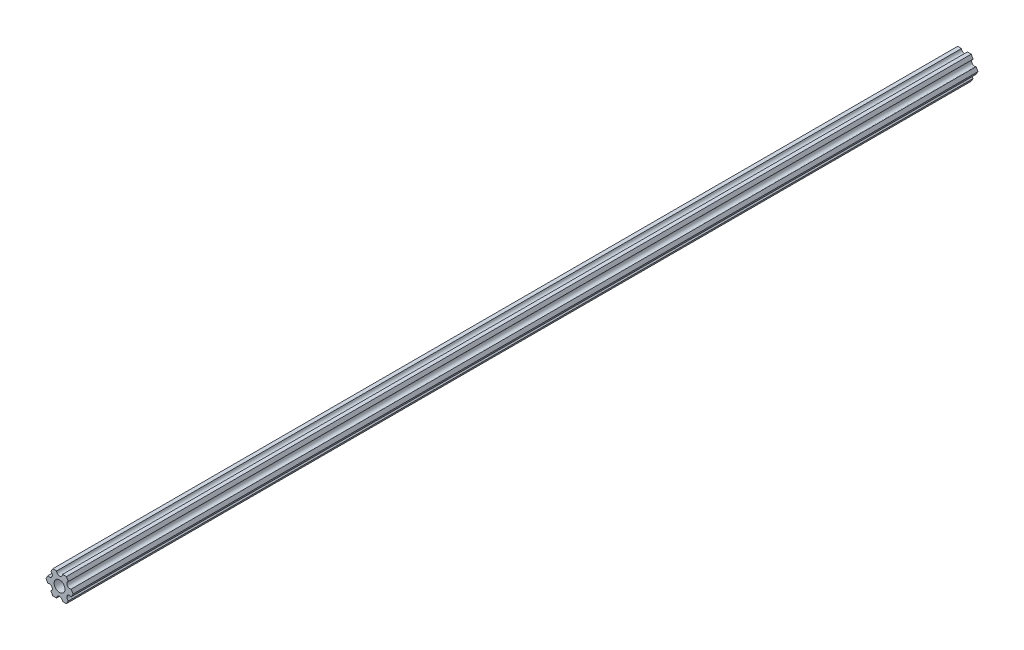
ISO-10303-21;
HEADER;
FILE_DESCRIPTION(('STEP AP214'),'2;1');
FILE_NAME('part.step','',(''),(''),'','','');
FILE_SCHEMA(('AUTOMOTIVE_DESIGN { 1 0 10303 214 1 1 1 1 }'));
ENDSEC;
DATA;
#1=APPLICATION_CONTEXT('core data for automotive mechanical design processes');
#2=APPLICATION_PROTOCOL_DEFINITION('international standard','automotive_design',2000,#1);
#3=PRODUCT_CONTEXT('',#1,'mechanical');
#4=PRODUCT('Part','Part','',(#3));
#5=PRODUCT_RELATED_PRODUCT_CATEGORY('part','',(#4));
#6=PRODUCT_DEFINITION_FORMATION('','',#4);
#7=PRODUCT_DEFINITION_CONTEXT('part definition',#1,'design');
#8=PRODUCT_DEFINITION('design','',#6,#7);
#9=PRODUCT_DEFINITION_SHAPE('','',#8);
#10=(LENGTH_UNIT() NAMED_UNIT(*) SI_UNIT(.MILLI.,.METRE.));
#11=(NAMED_UNIT(*) PLANE_ANGLE_UNIT() SI_UNIT($,.RADIAN.));
#12=(NAMED_UNIT(*) SI_UNIT($,.STERADIAN.) SOLID_ANGLE_UNIT());
#13=UNCERTAINTY_MEASURE_WITH_UNIT(LENGTH_MEASURE(1.E-05),#10,'distance_accuracy_value','');
#14=(GEOMETRIC_REPRESENTATION_CONTEXT(3) GLOBAL_UNCERTAINTY_ASSIGNED_CONTEXT((#13)) GLOBAL_UNIT_ASSIGNED_CONTEXT((#10,
#11,#12)) REPRESENTATION_CONTEXT('',''));
#15=CARTESIAN_POINT('',(0.,0.,0.));
#16=DIRECTION('',(0.,0.,1.));
#17=DIRECTION('',(1.,0.,0.));
#18=AXIS2_PLACEMENT_3D('',#15,#16,#17);
#19=CARTESIAN_POINT('',(5.49926112168156,3.17500033315933,244.475));
#20=DIRECTION('',(0.,0.,1.));
#21=DIRECTION('',(1.,0.,0.));
#22=AXIS2_PLACEMENT_3D('',#19,#20,#21);
#23=PLANE('',#22);
#24=DIRECTION('',(0.499999947533953,0.866025434075723,0.));
#25=VECTOR('',#24,1.);
#26=CARTESIAN_POINT('',(6.29301142309098,-1.80018429024546,244.475));
#27=LINE('',#26,#25);
#28=CARTESIAN_POINT('',(6.29301142309098,-1.80018429024546,244.475));
#29=VERTEX_POINT('',#28);
#30=CARTESIAN_POINT('',(7.33234841870826,4.44212519169686E-07,244.475));
#31=VERTEX_POINT('',#30);
#32=EDGE_CURVE('E230',#29,#31,#27,.T.);
#33=ORIENTED_EDGE('',*,*,#32,.T.);
#34=DIRECTION('',(-0.500000052466056,0.866025373493145,0.));
#35=VECTOR('',#34,1.);
#36=CARTESIAN_POINT('',(7.33234841870826,4.44212519169686E-07,244.475));
#37=LINE('',#36,#35);
#38=CARTESIAN_POINT('',(6.29301120497139,1.80018505273894,244.475));
#39=VERTEX_POINT('',#38);
#40=EDGE_CURVE('E127',#31,#39,#37,.T.);
#41=ORIENTED_EDGE('',*,*,#40,.T.);
#42=CARTESIAN_POINT('',(5.49926112168156,3.17500033315933,244.475));
#43=DIRECTION('',(0.,0.,-1.));
#44=DIRECTION('',(1.,0.,0.));
#45=AXIS2_PLACEMENT_3D('',#42,#43,#44);
#46=CIRCLE('',#45,1.5875);
#47=CARTESIAN_POINT('',(4.70551103839172,4.54981561357972,244.475));
#48=VERTEX_POINT('',#47);
#49=EDGE_CURVE('E291',#39,#48,#46,.T.);
#50=ORIENTED_EDGE('',*,*,#49,.T.);
#51=DIRECTION('',(-0.500000052466046,0.866025373493151,0.));
#52=VECTOR('',#51,1.);
#53=CARTESIAN_POINT('',(4.70551103839172,4.54981561357972,244.475));
#54=LINE('',#53,#52);
#55=CARTESIAN_POINT('',(3.66617382465481,6.35000022210627,244.475));
#56=VERTEX_POINT('',#55);
#57=EDGE_CURVE('E310',#48,#56,#54,.T.);
#58=ORIENTED_EDGE('',*,*,#57,.T.);
#59=DIRECTION('',(-0.999999999999998,-6.05825850611185E-08,0.));
#60=VECTOR('',#59,1.);
#61=CARTESIAN_POINT('',(3.66617382465481,6.35000022210627,244.475));
#62=LINE('',#61,#60);
#63=CARTESIAN_POINT('',(1.58749961530074,6.35000009617482,244.475));
#64=VERTEX_POINT('',#63);
#65=EDGE_CURVE('E307',#56,#64,#62,.T.);
#66=ORIENTED_EDGE('',*,*,#65,.T.);
#67=CARTESIAN_POINT('',(-3.84699260060323E-07,6.35,244.475));
#68=DIRECTION('',(0.,0.,-1.));
#69=DIRECTION('',(1.,0.,0.));
#70=AXIS2_PLACEMENT_3D('',#67,#68,#69);
#71=CIRCLE('',#70,1.5875);
#72=CARTESIAN_POINT('',(-1.58750038469926,6.34999990382518,244.475));
#73=VERTEX_POINT('',#72);
#74=EDGE_CURVE('E309',#64,#73,#71,.T.);
#75=ORIENTED_EDGE('',*,*,#74,.T.);
#76=DIRECTION('',(-0.999999999999998,-6.05825963273174E-08,0.));
#77=VECTOR('',#76,1.);
#78=CARTESIAN_POINT('',(-1.58750038469926,6.34999990382518,244.475));
#79=LINE('',#78,#77);
#80=CARTESIAN_POINT('',(-3.66617459405349,6.3499997778937,244.475));
#81=VERTEX_POINT('',#80);
#82=EDGE_CURVE('E312',#73,#81,#79,.T.);
#83=ORIENTED_EDGE('',*,*,#82,.T.);
#84=DIRECTION('',(-0.499999947533942,-0.866025434075729,0.));
#85=VECTOR('',#84,1.);
#86=CARTESIAN_POINT('',(-3.66617459405349,6.3499997778937,244.475));
#87=LINE('',#86,#85);
#88=CARTESIAN_POINT('',(-4.70551158967065,4.54981504343587,244.475));
#89=VERTEX_POINT('',#88);
#90=EDGE_CURVE('E318',#81,#89,#87,.T.);
#91=ORIENTED_EDGE('',*,*,#90,.T.);
#92=CARTESIAN_POINT('',(-5.49926150638082,3.17499966684067,244.475));
#93=DIRECTION('',(0.,0.,-1.));
#94=DIRECTION('',(1.,0.,0.));
#95=AXIS2_PLACEMENT_3D('',#92,#93,#94);
#96=CIRCLE('',#95,1.5875);
#97=CARTESIAN_POINT('',(-6.29301142309098,1.80018429024547,244.475));
#98=VERTEX_POINT('',#97);
#99=EDGE_CURVE('E320',#89,#98,#96,.T.);
#100=ORIENTED_EDGE('',*,*,#99,.T.);
#101=DIRECTION('',(-0.499999947533951,-0.866025434075724,0.));
#102=VECTOR('',#101,1.);
#103=CARTESIAN_POINT('',(-6.29301142309098,1.80018429024547,244.475));
#104=LINE('',#103,#102);
#105=CARTESIAN_POINT('',(-7.33234841870826,-4.44212523790841E-07,244.475));
#106=VERTEX_POINT('',#105);
#107=EDGE_CURVE('E322',#98,#106,#104,.T.);
#108=ORIENTED_EDGE('',*,*,#107,.T.);
#109=DIRECTION('',(0.500000052466045,-0.866025373493151,0.));
#110=VECTOR('',#109,1.);
#111=CARTESIAN_POINT('',(-7.33234841870826,-4.44212523790841E-07,244.475));
#112=LINE('',#111,#110);
#113=CARTESIAN_POINT('',(-6.29301120497141,-1.80018505273897,244.475));
#114=VERTEX_POINT('',#113);
#115=EDGE_CURVE('E324',#106,#114,#112,.T.);
#116=ORIENTED_EDGE('',*,*,#115,.T.);
#117=CARTESIAN_POINT('',(-5.49926112168156,-3.17500033315934,244.475));
#118=DIRECTION('',(0.,0.,-1.));
#119=DIRECTION('',(1.,0.,0.));
#120=AXIS2_PLACEMENT_3D('',#117,#118,#119);
#121=CIRCLE('',#120,1.5875);
#122=CARTESIAN_POINT('',(-4.70551103839172,-4.54981561357972,244.475));
#123=VERTEX_POINT('',#122);
#124=EDGE_CURVE('E326',#114,#123,#121,.T.);
#125=ORIENTED_EDGE('',*,*,#124,.T.);
#126=DIRECTION('',(0.500000052466045,-0.866025373493151,0.));
#127=VECTOR('',#126,1.);
#128=CARTESIAN_POINT('',(-4.70551103839172,-4.54981561357972,244.475));
#129=LINE('',#128,#127);
#130=CARTESIAN_POINT('',(-3.66617382465481,-6.35000022210628,244.475));
#131=VERTEX_POINT('',#130);
#132=EDGE_CURVE('E328',#123,#131,#129,.T.);
#133=ORIENTED_EDGE('',*,*,#132,.T.);
#134=DIRECTION('',(0.999999999999998,6.05825854783851E-08,0.));
#135=VECTOR('',#134,1.);
#136=CARTESIAN_POINT('',(-3.66617382465481,-6.35000022210628,244.475));
#137=LINE('',#136,#135);
#138=CARTESIAN_POINT('',(-1.58749961530074,-6.35000009617482,244.475));
#139=VERTEX_POINT('',#138);
#140=EDGE_CURVE('E330',#131,#139,#137,.T.);
#141=ORIENTED_EDGE('',*,*,#140,.T.);
#142=CARTESIAN_POINT('',(3.8469926204343E-07,-6.35,244.475));
#143=DIRECTION('',(0.,0.,-1.));
#144=DIRECTION('',(1.,0.,0.));
#145=AXIS2_PLACEMENT_3D('',#142,#143,#144);
#146=CIRCLE('',#145,1.5875);
#147=CARTESIAN_POINT('',(1.58750038469926,-6.34999990382518,244.475));
#148=VERTEX_POINT('',#147);
#149=EDGE_CURVE('E176',#139,#148,#146,.T.);
#150=ORIENTED_EDGE('',*,*,#149,.T.);
#151=DIRECTION('',(0.999999999999998,6.05825721258438E-08,0.));
#152=VECTOR('',#151,1.);
#153=CARTESIAN_POINT('',(1.58750038469926,-6.34999990382518,244.475));
#154=LINE('',#153,#152);
#155=CARTESIAN_POINT('',(3.66617459405346,-6.34999977789375,244.475));
#156=VERTEX_POINT('',#155);
#157=EDGE_CURVE('E170',#148,#156,#154,.T.);
#158=ORIENTED_EDGE('',*,*,#157,.T.);
#159=DIRECTION('',(0.499999947533941,0.86602543407573,0.));
#160=VECTOR('',#159,1.);
#161=CARTESIAN_POINT('',(3.66617459405346,-6.34999977789375,244.475));
#162=LINE('',#161,#160);
#163=CARTESIAN_POINT('',(4.70551158967065,-4.54981504343587,244.475));
#164=VERTEX_POINT('',#163);
#165=EDGE_CURVE('E174',#156,#164,#162,.T.);
#166=ORIENTED_EDGE('',*,*,#165,.T.);
#167=CARTESIAN_POINT('',(5.49926150638082,-3.17499966684067,244.475));
#168=DIRECTION('',(0.,0.,-1.));
#169=DIRECTION('',(1.,0.,0.));
#170=AXIS2_PLACEMENT_3D('',#167,#168,#169);
#171=CIRCLE('',#170,1.58750000000001);
#172=EDGE_CURVE('E54',#164,#29,#171,.T.);
#173=ORIENTED_EDGE('',*,*,#172,.T.);
#174=EDGE_LOOP('',(#33,#41,#50,#58,#66,#75,#83,#91,#100,#108,#116,#125,#133,#141,#150,#158,#166,#173));
#175=FACE_BOUND('',#174,.T.);
#176=CARTESIAN_POINT('',(0.,0.,244.475));
#177=DIRECTION('',(0.,0.,1.));
#178=DIRECTION('',(1.,0.,0.));
#179=AXIS2_PLACEMENT_3D('',#176,#177,#178);
#180=CIRCLE('',#179,2.9337);
#181=CARTESIAN_POINT('',(2.9337,0.,244.475));
#182=VERTEX_POINT('',#181);
#183=EDGE_CURVE('E199',#182,#182,#180,.T.);
#184=ORIENTED_EDGE('',*,*,#183,.F.);
#185=EDGE_LOOP('',(#184));
#186=FACE_BOUND('',#185,.T.);
#187=ADVANCED_FACE('F36',(#175,#186),#23,.T.);
#188=CARTESIAN_POINT('',(5.49926112168156,3.17500033315933,-244.475));
#189=DIRECTION('',(0.,0.,1.));
#190=DIRECTION('',(1.,0.,0.));
#191=AXIS2_PLACEMENT_3D('',#188,#189,#190);
#192=PLANE('',#191);
#193=DIRECTION('',(0.499999947533953,0.866025434075723,0.));
#194=VECTOR('',#193,1.);
#195=CARTESIAN_POINT('',(6.29301142309098,-1.80018429024546,-244.475));
#196=LINE('',#195,#194);
#197=CARTESIAN_POINT('',(6.29301142309098,-1.80018429024546,-244.475));
#198=VERTEX_POINT('',#197);
#199=CARTESIAN_POINT('',(7.33234841870826,4.44212519169686E-07,-244.475));
#200=VERTEX_POINT('',#199);
#201=EDGE_CURVE('E195',#198,#200,#196,.T.);
#202=ORIENTED_EDGE('',*,*,#201,.F.);
#203=CARTESIAN_POINT('',(5.49926150638082,-3.17499966684067,-244.475));
#204=DIRECTION('',(0.,0.,-1.));
#205=DIRECTION('',(1.,0.,0.));
#206=AXIS2_PLACEMENT_3D('',#203,#204,#205);
#207=CIRCLE('',#206,1.58750000000001);
#208=CARTESIAN_POINT('',(4.70551158967065,-4.54981504343587,-244.475));
#209=VERTEX_POINT('',#208);
#210=EDGE_CURVE('E119',#209,#198,#207,.T.);
#211=ORIENTED_EDGE('',*,*,#210,.F.);
#212=DIRECTION('',(0.499999947533941,0.86602543407573,0.));
#213=VECTOR('',#212,1.);
#214=CARTESIAN_POINT('',(3.66617459405346,-6.34999977789375,-244.475));
#215=LINE('',#214,#213);
#216=CARTESIAN_POINT('',(3.66617459405346,-6.34999977789375,-244.475));
#217=VERTEX_POINT('',#216);
#218=EDGE_CURVE('E113',#217,#209,#215,.T.);
#219=ORIENTED_EDGE('',*,*,#218,.F.);
#220=DIRECTION('',(0.999999999999998,6.05825721258438E-08,0.));
#221=VECTOR('',#220,1.);
#222=CARTESIAN_POINT('',(1.58750038469926,-6.34999990382518,-244.475));
#223=LINE('',#222,#221);
#224=CARTESIAN_POINT('',(1.58750038469926,-6.34999990382518,-244.475));
#225=VERTEX_POINT('',#224);
#226=EDGE_CURVE('E184',#225,#217,#223,.T.);
#227=ORIENTED_EDGE('',*,*,#226,.F.);
#228=CARTESIAN_POINT('',(3.8469926204343E-07,-6.35,-244.475));
#229=DIRECTION('',(0.,0.,-1.));
#230=DIRECTION('',(1.,0.,0.));
#231=AXIS2_PLACEMENT_3D('',#228,#229,#230);
#232=CIRCLE('',#231,1.5875);
#233=CARTESIAN_POINT('',(-1.58749961530074,-6.35000009617482,-244.475));
#234=VERTEX_POINT('',#233);
#235=EDGE_CURVE('E225',#234,#225,#232,.T.);
#236=ORIENTED_EDGE('',*,*,#235,.F.);
#237=DIRECTION('',(0.999999999999998,6.05825854783851E-08,0.));
#238=VECTOR('',#237,1.);
#239=CARTESIAN_POINT('',(-3.66617382465481,-6.35000022210628,-244.475));
#240=LINE('',#239,#238);
#241=CARTESIAN_POINT('',(-3.66617382465481,-6.35000022210628,-244.475));
#242=VERTEX_POINT('',#241);
#243=EDGE_CURVE('E223',#242,#234,#240,.T.);
#244=ORIENTED_EDGE('',*,*,#243,.F.);
#245=DIRECTION('',(0.500000052466045,-0.866025373493151,0.));
#246=VECTOR('',#245,1.);
#247=CARTESIAN_POINT('',(-4.70551103839172,-4.54981561357972,-244.475));
#248=LINE('',#247,#246);
#249=CARTESIAN_POINT('',(-4.70551103839172,-4.54981561357972,-244.475));
#250=VERTEX_POINT('',#249);
#251=EDGE_CURVE('E221',#250,#242,#248,.T.);
#252=ORIENTED_EDGE('',*,*,#251,.F.);
#253=CARTESIAN_POINT('',(-5.49926112168156,-3.17500033315934,-244.475));
#254=DIRECTION('',(0.,0.,-1.));
#255=DIRECTION('',(1.,0.,0.));
#256=AXIS2_PLACEMENT_3D('',#253,#254,#255);
#257=CIRCLE('',#256,1.5875);
#258=CARTESIAN_POINT('',(-6.29301120497141,-1.80018505273897,-244.475));
#259=VERTEX_POINT('',#258);
#260=EDGE_CURVE('E219',#259,#250,#257,.T.);
#261=ORIENTED_EDGE('',*,*,#260,.F.);
#262=DIRECTION('',(0.500000052466045,-0.866025373493151,0.));
#263=VECTOR('',#262,1.);
#264=CARTESIAN_POINT('',(-7.33234841870826,-4.44212523790841E-07,-244.475));
#265=LINE('',#264,#263);
#266=CARTESIAN_POINT('',(-7.33234841870826,-4.44212523790841E-07,-244.475));
#267=VERTEX_POINT('',#266);
#268=EDGE_CURVE('E217',#267,#259,#265,.T.);
#269=ORIENTED_EDGE('',*,*,#268,.F.);
#270=DIRECTION('',(-0.499999947533951,-0.866025434075724,0.));
#271=VECTOR('',#270,1.);
#272=CARTESIAN_POINT('',(-6.29301142309098,1.80018429024547,-244.475));
#273=LINE('',#272,#271);
#274=CARTESIAN_POINT('',(-6.29301142309098,1.80018429024547,-244.475));
#275=VERTEX_POINT('',#274);
#276=EDGE_CURVE('E215',#275,#267,#273,.T.);
#277=ORIENTED_EDGE('',*,*,#276,.F.);
#278=CARTESIAN_POINT('',(-5.49926150638082,3.17499966684067,-244.475));
#279=DIRECTION('',(0.,0.,-1.));
#280=DIRECTION('',(1.,0.,0.));
#281=AXIS2_PLACEMENT_3D('',#278,#279,#280);
#282=CIRCLE('',#281,1.5875);
#283=CARTESIAN_POINT('',(-4.70551158967065,4.54981504343587,-244.475));
#284=VERTEX_POINT('',#283);
#285=EDGE_CURVE('E213',#284,#275,#282,.T.);
#286=ORIENTED_EDGE('',*,*,#285,.F.);
#287=DIRECTION('',(-0.499999947533942,-0.866025434075729,0.));
#288=VECTOR('',#287,1.);
#289=CARTESIAN_POINT('',(-3.66617459405349,6.3499997778937,-244.475));
#290=LINE('',#289,#288);
#291=CARTESIAN_POINT('',(-3.66617459405349,6.3499997778937,-244.475));
#292=VERTEX_POINT('',#291);
#293=EDGE_CURVE('E211',#292,#284,#290,.T.);
#294=ORIENTED_EDGE('',*,*,#293,.F.);
#295=DIRECTION('',(-0.999999999999998,-6.05825963273174E-08,0.));
#296=VECTOR('',#295,1.);
#297=CARTESIAN_POINT('',(-1.58750038469926,6.34999990382518,-244.475));
#298=LINE('',#297,#296);
#299=CARTESIAN_POINT('',(-1.58750038469926,6.34999990382518,-244.475));
#300=VERTEX_POINT('',#299);
#301=EDGE_CURVE('E209',#300,#292,#298,.T.);
#302=ORIENTED_EDGE('',*,*,#301,.F.);
#303=CARTESIAN_POINT('',(-3.84699260060323E-07,6.35,-244.475));
#304=DIRECTION('',(0.,0.,-1.));
#305=DIRECTION('',(1.,0.,0.));
#306=AXIS2_PLACEMENT_3D('',#303,#304,#305);
#307=CIRCLE('',#306,1.5875);
#308=CARTESIAN_POINT('',(1.58749961530074,6.35000009617482,-244.475));
#309=VERTEX_POINT('',#308);
#310=EDGE_CURVE('E207',#309,#300,#307,.T.);
#311=ORIENTED_EDGE('',*,*,#310,.F.);
#312=DIRECTION('',(-0.999999999999998,-6.05825850611185E-08,0.));
#313=VECTOR('',#312,1.);
#314=CARTESIAN_POINT('',(3.66617382465481,6.35000022210627,-244.475));
#315=LINE('',#314,#313);
#316=CARTESIAN_POINT('',(3.66617382465481,6.35000022210627,-244.475));
#317=VERTEX_POINT('',#316);
#318=EDGE_CURVE('E205',#317,#309,#315,.T.);
#319=ORIENTED_EDGE('',*,*,#318,.F.);
#320=DIRECTION('',(-0.500000052466046,0.866025373493151,0.));
#321=VECTOR('',#320,1.);
#322=CARTESIAN_POINT('',(4.70551103839172,4.54981561357972,-244.475));
#323=LINE('',#322,#321);
#324=CARTESIAN_POINT('',(4.70551103839172,4.54981561357972,-244.475));
#325=VERTEX_POINT('',#324);
#326=EDGE_CURVE('E203',#325,#317,#323,.T.);
#327=ORIENTED_EDGE('',*,*,#326,.F.);
#328=CARTESIAN_POINT('',(5.49926112168156,3.17500033315933,-244.475));
#329=DIRECTION('',(0.,0.,-1.));
#330=DIRECTION('',(1.,0.,0.));
#331=AXIS2_PLACEMENT_3D('',#328,#329,#330);
#332=CIRCLE('',#331,1.5875);
#333=CARTESIAN_POINT('',(6.29301120497139,1.80018505273894,-244.475));
#334=VERTEX_POINT('',#333);
#335=EDGE_CURVE('E201',#334,#325,#332,.T.);
#336=ORIENTED_EDGE('',*,*,#335,.F.);
#337=DIRECTION('',(-0.500000052466056,0.866025373493145,0.));
#338=VECTOR('',#337,1.);
#339=CARTESIAN_POINT('',(7.33234841870826,4.44212519169686E-07,-244.475));
#340=LINE('',#339,#338);
#341=EDGE_CURVE('E198',#200,#334,#340,.T.);
#342=ORIENTED_EDGE('',*,*,#341,.F.);
#343=EDGE_LOOP('',(#202,#211,#219,#227,#236,#244,#252,#261,#269,#277,#286,#294,#302,#311,#319,
#327,#336,#342));
#344=FACE_BOUND('',#343,.T.);
#345=CARTESIAN_POINT('',(0.,0.,-244.475));
#346=DIRECTION('',(0.,0.,1.));
#347=DIRECTION('',(1.,0.,0.));
#348=AXIS2_PLACEMENT_3D('',#345,#346,#347);
#349=CIRCLE('',#348,2.9337);
#350=CARTESIAN_POINT('',(2.9337,0.,-244.475));
#351=VERTEX_POINT('',#350);
#352=EDGE_CURVE('E555',#351,#351,#349,.T.);
#353=ORIENTED_EDGE('',*,*,#352,.T.);
#354=EDGE_LOOP('',(#353));
#355=FACE_BOUND('',#354,.T.);
#356=ADVANCED_FACE('F295',(#344,#355),#192,.F.);
#357=CARTESIAN_POINT('',(6.29301142309098,-1.80018429024546,244.475));
#358=DIRECTION('',(-0.866025434075723,0.499999947533953,0.));
#359=DIRECTION('',(-0.499999947533953,-0.866025434075723,0.));
#360=AXIS2_PLACEMENT_3D('',#357,#358,#359);
#361=PLANE('',#360);
#362=ORIENTED_EDGE('',*,*,#201,.T.);
#363=DIRECTION('',(0.,0.,-1.));
#364=VECTOR('',#363,1.);
#365=CARTESIAN_POINT('',(7.33234841870826,4.44212519169686E-07,244.475));
#366=LINE('',#365,#364);
#367=EDGE_CURVE('E11',#31,#200,#366,.T.);
#368=ORIENTED_EDGE('',*,*,#367,.F.);
#369=ORIENTED_EDGE('',*,*,#32,.F.);
#370=DIRECTION('',(0.,0.,-1.));
#371=VECTOR('',#370,1.);
#372=CARTESIAN_POINT('',(6.29301142309098,-1.80018429024546,244.475));
#373=LINE('',#372,#371);
#374=EDGE_CURVE('E191',#29,#198,#373,.T.);
#375=ORIENTED_EDGE('',*,*,#374,.T.);
#376=EDGE_LOOP('',(#362,#368,#369,#375));
#377=FACE_BOUND('',#376,.T.);
#378=ADVANCED_FACE('F38',(#377),#361,.F.);
#379=CARTESIAN_POINT('',(7.33234841870826,4.44212519169686E-07,244.475));
#380=DIRECTION('',(-0.866025373493145,-0.500000052466057,0.));
#381=DIRECTION('',(0.500000052466056,-0.866025373493145,0.));
#382=AXIS2_PLACEMENT_3D('',#379,#380,#381);
#383=PLANE('',#382);
#384=ORIENTED_EDGE('',*,*,#341,.T.);
#385=DIRECTION('',(0.,0.,-1.));
#386=VECTOR('',#385,1.);
#387=CARTESIAN_POINT('',(6.29301120497139,1.80018505273894,244.475));
#388=LINE('',#387,#386);
#389=EDGE_CURVE('E46',#39,#334,#388,.T.);
#390=ORIENTED_EDGE('',*,*,#389,.F.);
#391=ORIENTED_EDGE('',*,*,#40,.F.);
#392=ORIENTED_EDGE('',*,*,#367,.T.);
#393=EDGE_LOOP('',(#384,#390,#391,#392));
#394=FACE_BOUND('',#393,.T.);
#395=ADVANCED_FACE('F364',(#394),#383,.F.);
#396=CARTESIAN_POINT('',(5.49926112168156,3.17500033315933,244.475));
#397=DIRECTION('',(0.,0.,-1.));
#398=DIRECTION('',(-1.,0.,0.));
#399=AXIS2_PLACEMENT_3D('',#396,#397,#398);
#400=CYLINDRICAL_SURFACE('',#399,1.5875);
#401=ORIENTED_EDGE('',*,*,#335,.T.);
#402=DIRECTION('',(0.,0.,-1.));
#403=VECTOR('',#402,1.);
#404=CARTESIAN_POINT('',(4.70551103839172,4.54981561357972,244.475));
#405=LINE('',#404,#403);
#406=EDGE_CURVE('E281',#48,#325,#405,.T.);
#407=ORIENTED_EDGE('',*,*,#406,.F.);
#408=ORIENTED_EDGE('',*,*,#49,.F.);
#409=ORIENTED_EDGE('',*,*,#389,.T.);
#410=EDGE_LOOP('',(#401,#407,#408,#409));
#411=FACE_BOUND('',#410,.T.);
#412=ADVANCED_FACE('F289',(#411),#400,.F.);
#413=CARTESIAN_POINT('',(4.70551103839172,4.54981561357972,244.475));
#414=DIRECTION('',(-0.866025373493151,-0.500000052466046,0.));
#415=DIRECTION('',(0.500000052466046,-0.866025373493151,0.));
#416=AXIS2_PLACEMENT_3D('',#413,#414,#415);
#417=PLANE('',#416);
#418=ORIENTED_EDGE('',*,*,#326,.T.);
#419=DIRECTION('',(0.,0.,-1.));
#420=VECTOR('',#419,1.);
#421=CARTESIAN_POINT('',(3.66617382465481,6.35000022210627,244.475));
#422=LINE('',#421,#420);
#423=EDGE_CURVE('E277',#56,#317,#422,.T.);
#424=ORIENTED_EDGE('',*,*,#423,.F.);
#425=ORIENTED_EDGE('',*,*,#57,.F.);
#426=ORIENTED_EDGE('',*,*,#406,.T.);
#427=EDGE_LOOP('',(#418,#424,#425,#426));
#428=FACE_BOUND('',#427,.T.);
#429=ADVANCED_FACE('F301',(#428),#417,.F.);
#430=CARTESIAN_POINT('',(3.66617382465481,6.35000022210627,244.475));
#431=DIRECTION('',(6.05825850611185E-08,-0.999999999999998,0.));
#432=DIRECTION('',(0.999999999999998,6.05825850611185E-08,0.));
#433=AXIS2_PLACEMENT_3D('',#430,#431,#432);
#434=PLANE('',#433);
#435=ORIENTED_EDGE('',*,*,#318,.T.);
#436=DIRECTION('',(0.,0.,-1.));
#437=VECTOR('',#436,1.);
#438=CARTESIAN_POINT('',(1.58749961530074,6.35000009617482,244.475));
#439=LINE('',#438,#437);
#440=EDGE_CURVE('E273',#64,#309,#439,.T.);
#441=ORIENTED_EDGE('',*,*,#440,.F.);
#442=ORIENTED_EDGE('',*,*,#65,.F.);
#443=ORIENTED_EDGE('',*,*,#423,.T.);
#444=EDGE_LOOP('',(#435,#441,#442,#443));
#445=FACE_BOUND('',#444,.T.);
#446=ADVANCED_FACE('F305',(#445),#434,.F.);
#447=CARTESIAN_POINT('',(-3.84699260060323E-07,6.35,244.475));
#448=DIRECTION('',(0.,0.,-1.));
#449=DIRECTION('',(-1.,0.,0.));
#450=AXIS2_PLACEMENT_3D('',#447,#448,#449);
#451=CYLINDRICAL_SURFACE('',#450,1.5875);
#452=ORIENTED_EDGE('',*,*,#310,.T.);
#453=DIRECTION('',(0.,0.,-1.));
#454=VECTOR('',#453,1.);
#455=CARTESIAN_POINT('',(-1.58750038469926,6.34999990382518,244.475));
#456=LINE('',#455,#454);
#457=EDGE_CURVE('E269',#73,#300,#456,.T.);
#458=ORIENTED_EDGE('',*,*,#457,.F.);
#459=ORIENTED_EDGE('',*,*,#74,.F.);
#460=ORIENTED_EDGE('',*,*,#440,.T.);
#461=EDGE_LOOP('',(#452,#458,#459,#460));
#462=FACE_BOUND('',#461,.T.);
#463=ADVANCED_FACE('F377',(#462),#451,.F.);
#464=CARTESIAN_POINT('',(-1.58750038469926,6.34999990382518,244.475));
#465=DIRECTION('',(6.05825963273174E-08,-0.999999999999998,0.));
#466=DIRECTION('',(0.999999999999998,6.05825963273174E-08,0.));
#467=AXIS2_PLACEMENT_3D('',#464,#465,#466);
#468=PLANE('',#467);
#469=ORIENTED_EDGE('',*,*,#301,.T.);
#470=DIRECTION('',(0.,0.,-1.));
#471=VECTOR('',#470,1.);
#472=CARTESIAN_POINT('',(-3.66617459405349,6.3499997778937,244.475));
#473=LINE('',#472,#471);
#474=EDGE_CURVE('E265',#81,#292,#473,.T.);
#475=ORIENTED_EDGE('',*,*,#474,.F.);
#476=ORIENTED_EDGE('',*,*,#82,.F.);
#477=ORIENTED_EDGE('',*,*,#457,.T.);
#478=EDGE_LOOP('',(#469,#475,#476,#477));
#479=FACE_BOUND('',#478,.T.);
#480=ADVANCED_FACE('F380',(#479),#468,.F.);
#481=CARTESIAN_POINT('',(-3.66617459405349,6.3499997778937,244.475));
#482=DIRECTION('',(0.866025434075729,-0.499999947533942,0.));
#483=DIRECTION('',(0.499999947533943,0.866025434075729,0.));
#484=AXIS2_PLACEMENT_3D('',#481,#482,#483);
#485=PLANE('',#484);
#486=ORIENTED_EDGE('',*,*,#293,.T.);
#487=DIRECTION('',(0.,0.,-1.));
#488=VECTOR('',#487,1.);
#489=CARTESIAN_POINT('',(-4.70551158967065,4.54981504343587,244.475));
#490=LINE('',#489,#488);
#491=EDGE_CURVE('E261',#89,#284,#490,.T.);
#492=ORIENTED_EDGE('',*,*,#491,.F.);
#493=ORIENTED_EDGE('',*,*,#90,.F.);
#494=ORIENTED_EDGE('',*,*,#474,.T.);
#495=EDGE_LOOP('',(#486,#492,#493,#494));
#496=FACE_BOUND('',#495,.T.);
#497=ADVANCED_FACE('F384',(#496),#485,.F.);
#498=CARTESIAN_POINT('',(-5.49926150638082,3.17499966684067,244.475));
#499=DIRECTION('',(0.,0.,-1.));
#500=DIRECTION('',(-1.,0.,0.));
#501=AXIS2_PLACEMENT_3D('',#498,#499,#500);
#502=CYLINDRICAL_SURFACE('',#501,1.5875);
#503=ORIENTED_EDGE('',*,*,#285,.T.);
#504=DIRECTION('',(0.,0.,-1.));
#505=VECTOR('',#504,1.);
#506=CARTESIAN_POINT('',(-6.29301142309098,1.80018429024547,244.475));
#507=LINE('',#506,#505);
#508=EDGE_CURVE('E257',#98,#275,#507,.T.);
#509=ORIENTED_EDGE('',*,*,#508,.F.);
#510=ORIENTED_EDGE('',*,*,#99,.F.);
#511=ORIENTED_EDGE('',*,*,#491,.T.);
#512=EDGE_LOOP('',(#503,#509,#510,#511));
#513=FACE_BOUND('',#512,.T.);
#514=ADVANCED_FACE('F388',(#513),#502,.F.);
#515=CARTESIAN_POINT('',(-6.29301142309098,1.80018429024547,244.475));
#516=DIRECTION('',(0.866025434075724,-0.499999947533952,0.));
#517=DIRECTION('',(0.499999947533952,0.866025434075724,0.));
#518=AXIS2_PLACEMENT_3D('',#515,#516,#517);
#519=PLANE('',#518);
#520=ORIENTED_EDGE('',*,*,#276,.T.);
#521=DIRECTION('',(0.,0.,-1.));
#522=VECTOR('',#521,1.);
#523=CARTESIAN_POINT('',(-7.33234841870826,-4.44212523790841E-07,244.475));
#524=LINE('',#523,#522);
#525=EDGE_CURVE('E253',#106,#267,#524,.T.);
#526=ORIENTED_EDGE('',*,*,#525,.F.);
#527=ORIENTED_EDGE('',*,*,#107,.F.);
#528=ORIENTED_EDGE('',*,*,#508,.T.);
#529=EDGE_LOOP('',(#520,#526,#527,#528));
#530=FACE_BOUND('',#529,.T.);
#531=ADVANCED_FACE('F392',(#530),#519,.F.);
#532=CARTESIAN_POINT('',(-7.33234841870826,-4.44212523790841E-07,244.475));
#533=DIRECTION('',(0.866025373493151,0.500000052466045,0.));
#534=DIRECTION('',(-0.500000052466045,0.866025373493151,0.));
#535=AXIS2_PLACEMENT_3D('',#532,#533,#534);
#536=PLANE('',#535);
#537=ORIENTED_EDGE('',*,*,#268,.T.);
#538=DIRECTION('',(0.,0.,-1.));
#539=VECTOR('',#538,1.);
#540=CARTESIAN_POINT('',(-6.29301120497141,-1.80018505273897,244.475));
#541=LINE('',#540,#539);
#542=EDGE_CURVE('E249',#114,#259,#541,.T.);
#543=ORIENTED_EDGE('',*,*,#542,.F.);
#544=ORIENTED_EDGE('',*,*,#115,.F.);
#545=ORIENTED_EDGE('',*,*,#525,.T.);
#546=EDGE_LOOP('',(#537,#543,#544,#545));
#547=FACE_BOUND('',#546,.T.);
#548=ADVANCED_FACE('F396',(#547),#536,.F.);
#549=CARTESIAN_POINT('',(-5.49926112168156,-3.17500033315934,244.475));
#550=DIRECTION('',(0.,0.,-1.));
#551=DIRECTION('',(-1.,0.,0.));
#552=AXIS2_PLACEMENT_3D('',#549,#550,#551);
#553=CYLINDRICAL_SURFACE('',#552,1.5875);
#554=ORIENTED_EDGE('',*,*,#260,.T.);
#555=DIRECTION('',(0.,0.,-1.));
#556=VECTOR('',#555,1.);
#557=CARTESIAN_POINT('',(-4.70551103839172,-4.54981561357972,244.475));
#558=LINE('',#557,#556);
#559=EDGE_CURVE('E245',#123,#250,#558,.T.);
#560=ORIENTED_EDGE('',*,*,#559,.F.);
#561=ORIENTED_EDGE('',*,*,#124,.F.);
#562=ORIENTED_EDGE('',*,*,#542,.T.);
#563=EDGE_LOOP('',(#554,#560,#561,#562));
#564=FACE_BOUND('',#563,.T.);
#565=ADVANCED_FACE('F400',(#564),#553,.F.);
#566=CARTESIAN_POINT('',(-4.70551103839172,-4.54981561357972,244.475));
#567=DIRECTION('',(0.866025373493151,0.500000052466045,0.));
#568=DIRECTION('',(-0.500000052466045,0.866025373493151,0.));
#569=AXIS2_PLACEMENT_3D('',#566,#567,#568);
#570=PLANE('',#569);
#571=ORIENTED_EDGE('',*,*,#251,.T.);
#572=DIRECTION('',(0.,0.,-1.));
#573=VECTOR('',#572,1.);
#574=CARTESIAN_POINT('',(-3.66617382465481,-6.35000022210628,244.475));
#575=LINE('',#574,#573);
#576=EDGE_CURVE('E241',#131,#242,#575,.T.);
#577=ORIENTED_EDGE('',*,*,#576,.F.);
#578=ORIENTED_EDGE('',*,*,#132,.F.);
#579=ORIENTED_EDGE('',*,*,#559,.T.);
#580=EDGE_LOOP('',(#571,#577,#578,#579));
#581=FACE_BOUND('',#580,.T.);
#582=ADVANCED_FACE('F404',(#581),#570,.F.);
#583=CARTESIAN_POINT('',(-3.66617382465481,-6.35000022210628,244.475));
#584=DIRECTION('',(-6.05825854783851E-08,0.999999999999998,0.));
#585=DIRECTION('',(-0.999999999999998,-6.05825854783851E-08,0.));
#586=AXIS2_PLACEMENT_3D('',#583,#584,#585);
#587=PLANE('',#586);
#588=ORIENTED_EDGE('',*,*,#243,.T.);
#589=DIRECTION('',(0.,0.,-1.));
#590=VECTOR('',#589,1.);
#591=CARTESIAN_POINT('',(-1.58749961530074,-6.35000009617482,244.475));
#592=LINE('',#591,#590);
#593=EDGE_CURVE('E237',#139,#234,#592,.T.);
#594=ORIENTED_EDGE('',*,*,#593,.F.);
#595=ORIENTED_EDGE('',*,*,#140,.F.);
#596=ORIENTED_EDGE('',*,*,#576,.T.);
#597=EDGE_LOOP('',(#588,#594,#595,#596));
#598=FACE_BOUND('',#597,.T.);
#599=ADVANCED_FACE('F336',(#598),#587,.F.);
#600=CARTESIAN_POINT('',(3.8469926204343E-07,-6.35,244.475));
#601=DIRECTION('',(0.,0.,-1.));
#602=DIRECTION('',(-1.,0.,0.));
#603=AXIS2_PLACEMENT_3D('',#600,#601,#602);
#604=CYLINDRICAL_SURFACE('',#603,1.5875);
#605=ORIENTED_EDGE('',*,*,#235,.T.);
#606=DIRECTION('',(0.,0.,-1.));
#607=VECTOR('',#606,1.);
#608=CARTESIAN_POINT('',(1.58750038469926,-6.34999990382518,244.475));
#609=LINE('',#608,#607);
#610=EDGE_CURVE('E186',#148,#225,#609,.T.);
#611=ORIENTED_EDGE('',*,*,#610,.F.);
#612=ORIENTED_EDGE('',*,*,#149,.F.);
#613=ORIENTED_EDGE('',*,*,#593,.T.);
#614=EDGE_LOOP('',(#605,#611,#612,#613));
#615=FACE_BOUND('',#614,.T.);
#616=ADVANCED_FACE('F340',(#615),#604,.F.);
#617=CARTESIAN_POINT('',(1.58750038469926,-6.34999990382518,244.475));
#618=DIRECTION('',(-6.05825721258438E-08,0.999999999999998,0.));
#619=DIRECTION('',(-0.999999999999998,-6.05825721258438E-08,0.));
#620=AXIS2_PLACEMENT_3D('',#617,#618,#619);
#621=PLANE('',#620);
#622=ORIENTED_EDGE('',*,*,#226,.T.);
#623=DIRECTION('',(0.,0.,-1.));
#624=VECTOR('',#623,1.);
#625=CARTESIAN_POINT('',(3.66617459405346,-6.34999977789375,244.475));
#626=LINE('',#625,#624);
#627=EDGE_CURVE('E181',#156,#217,#626,.T.);
#628=ORIENTED_EDGE('',*,*,#627,.F.);
#629=ORIENTED_EDGE('',*,*,#157,.F.);
#630=ORIENTED_EDGE('',*,*,#610,.T.);
#631=EDGE_LOOP('',(#622,#628,#629,#630));
#632=FACE_BOUND('',#631,.T.);
#633=ADVANCED_FACE('F182',(#632),#621,.F.);
#634=CARTESIAN_POINT('',(3.66617459405346,-6.34999977789375,244.475));
#635=DIRECTION('',(-0.86602543407573,0.499999947533941,0.));
#636=DIRECTION('',(-0.499999947533941,-0.86602543407573,0.));
#637=AXIS2_PLACEMENT_3D('',#634,#635,#636);
#638=PLANE('',#637);
#639=ORIENTED_EDGE('',*,*,#218,.T.);
#640=DIRECTION('',(0.,0.,-1.));
#641=VECTOR('',#640,1.);
#642=CARTESIAN_POINT('',(4.70551158967065,-4.54981504343587,244.475));
#643=LINE('',#642,#641);
#644=EDGE_CURVE('E187',#164,#209,#643,.T.);
#645=ORIENTED_EDGE('',*,*,#644,.F.);
#646=ORIENTED_EDGE('',*,*,#165,.F.);
#647=ORIENTED_EDGE('',*,*,#627,.T.);
#648=EDGE_LOOP('',(#639,#645,#646,#647));
#649=FACE_BOUND('',#648,.T.);
#650=ADVANCED_FACE('F189',(#649),#638,.F.);
#651=CARTESIAN_POINT('',(5.49926150638082,-3.17499966684067,244.475));
#652=DIRECTION('',(0.,0.,-1.));
#653=DIRECTION('',(-1.,0.,0.));
#654=AXIS2_PLACEMENT_3D('',#651,#652,#653);
#655=CYLINDRICAL_SURFACE('',#654,1.58750000000001);
#656=ORIENTED_EDGE('',*,*,#210,.T.);
#657=ORIENTED_EDGE('',*,*,#374,.F.);
#658=ORIENTED_EDGE('',*,*,#172,.F.);
#659=ORIENTED_EDGE('',*,*,#644,.T.);
#660=EDGE_LOOP('',(#656,#657,#658,#659));
#661=FACE_BOUND('',#660,.T.);
#662=ADVANCED_FACE('F344',(#661),#655,.F.);
#663=CARTESIAN_POINT('',(0.,0.,244.475));
#664=DIRECTION('',(0.,0.,-1.));
#665=DIRECTION('',(-1.,0.,0.));
#666=AXIS2_PLACEMENT_3D('',#663,#664,#665);
#667=CYLINDRICAL_SURFACE('',#666,2.9337);
#668=ORIENTED_EDGE('',*,*,#183,.T.);
#669=EDGE_LOOP('',(#668));
#670=FACE_BOUND('',#669,.T.);
#671=ORIENTED_EDGE('',*,*,#352,.F.);
#672=EDGE_LOOP('',(#671));
#673=FACE_BOUND('',#672,.T.);
#674=ADVANCED_FACE('F346',(#670,#673),#667,.F.);
#675=CLOSED_SHELL('',(#187,#356,#378,#395,#412,#429,#446,#463,#480,#497,#514,#531,#548,#565,
#582,#599,#616,#633,#650,#662,#674));
#676=MANIFOLD_SOLID_BREP('B2',#675);
#677=ADVANCED_BREP_SHAPE_REPRESENTATION('',(#18,#676),#14);
#678=SHAPE_DEFINITION_REPRESENTATION(#9,#677);
ENDSEC;
END-ISO-10303-21;
